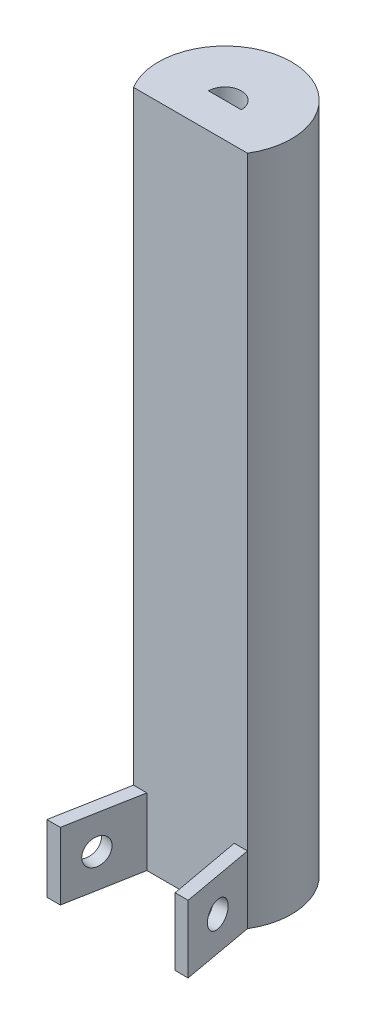
ISO-10303-21;
HEADER;
FILE_DESCRIPTION(('STEP AP214'),'2;1');
FILE_NAME('part.step','',(''),(''),'','','');
FILE_SCHEMA(('AUTOMOTIVE_DESIGN { 1 0 10303 214 1 1 1 1 }'));
ENDSEC;
DATA;
#1=APPLICATION_CONTEXT('core data for automotive mechanical design processes');
#2=APPLICATION_PROTOCOL_DEFINITION('international standard','automotive_design',2000,#1);
#3=PRODUCT_CONTEXT('',#1,'mechanical');
#4=PRODUCT('Part','Part','',(#3));
#5=PRODUCT_RELATED_PRODUCT_CATEGORY('part','',(#4));
#6=PRODUCT_DEFINITION_FORMATION('','',#4);
#7=PRODUCT_DEFINITION_CONTEXT('part definition',#1,'design');
#8=PRODUCT_DEFINITION('design','',#6,#7);
#9=PRODUCT_DEFINITION_SHAPE('','',#8);
#10=(LENGTH_UNIT() NAMED_UNIT(*) SI_UNIT(.MILLI.,.METRE.));
#11=(NAMED_UNIT(*) PLANE_ANGLE_UNIT() SI_UNIT($,.RADIAN.));
#12=(NAMED_UNIT(*) SI_UNIT($,.STERADIAN.) SOLID_ANGLE_UNIT());
#13=UNCERTAINTY_MEASURE_WITH_UNIT(LENGTH_MEASURE(1.E-05),#10,'distance_accuracy_value','');
#14=(GEOMETRIC_REPRESENTATION_CONTEXT(3) GLOBAL_UNCERTAINTY_ASSIGNED_CONTEXT((#13)) GLOBAL_UNIT_ASSIGNED_CONTEXT((#10,
#11,#12)) REPRESENTATION_CONTEXT('',''));
#15=CARTESIAN_POINT('',(0.,0.,0.));
#16=DIRECTION('',(0.,0.,1.));
#17=DIRECTION('',(1.,0.,0.));
#18=AXIS2_PLACEMENT_3D('',#15,#16,#17);
#19=CARTESIAN_POINT('',(0.,-127.254,0.));
#20=DIRECTION('',(0.,1.,0.));
#21=DIRECTION('',(0.,0.,1.));
#22=AXIS2_PLACEMENT_3D('',#19,#20,#21);
#23=CYLINDRICAL_SURFACE('',#22,12.6251531398367);
#24=DIRECTION('',(0.,-1.,0.));
#25=VECTOR('',#24,1.);
#26=CARTESIAN_POINT('',(10.8004451861737,28.448,6.53795652974117));
#27=LINE('',#26,#25);
#28=CARTESIAN_POINT('',(10.8004451861737,0.,6.53795652974117));
#29=VERTEX_POINT('',#28);
#30=CARTESIAN_POINT('',(10.8004451861737,-114.498809878987,6.53795652974117));
#31=VERTEX_POINT('',#30);
#32=EDGE_CURVE('E197',#29,#31,#27,.T.);
#33=ORIENTED_EDGE('',*,*,#32,.T.);
#34=DIRECTION('',(0.,-1.,0.));
#35=VECTOR('',#34,1.);
#36=CARTESIAN_POINT('',(10.8004451861737,-114.498809878987,6.53795652974117));
#37=LINE('',#36,#35);
#38=CARTESIAN_POINT('',(10.8004451861737,-127.254,6.53795652974117));
#39=VERTEX_POINT('',#38);
#40=EDGE_CURVE('E137',#31,#39,#37,.T.);
#41=ORIENTED_EDGE('',*,*,#40,.T.);
#42=CARTESIAN_POINT('',(0.,-127.254,0.));
#43=DIRECTION('',(0.,1.,0.));
#44=DIRECTION('',(0.,0.,1.));
#45=AXIS2_PLACEMENT_3D('',#42,#43,#44);
#46=CIRCLE('',#45,12.6251531398367);
#47=CARTESIAN_POINT('',(-10.8004451861737,-127.254,6.53795652974117));
#48=VERTEX_POINT('',#47);
#49=EDGE_CURVE('E202',#39,#48,#46,.T.);
#50=ORIENTED_EDGE('',*,*,#49,.T.);
#51=DIRECTION('',(0.,-1.,0.));
#52=VECTOR('',#51,1.);
#53=CARTESIAN_POINT('',(-10.8004451861737,-114.498809878987,6.53795652974117));
#54=LINE('',#53,#52);
#55=CARTESIAN_POINT('',(-10.8004451861737,-114.498809878987,6.53795652974117));
#56=VERTEX_POINT('',#55);
#57=EDGE_CURVE('E181',#56,#48,#54,.T.);
#58=ORIENTED_EDGE('',*,*,#57,.F.);
#59=DIRECTION('',(0.,-1.,0.));
#60=VECTOR('',#59,1.);
#61=CARTESIAN_POINT('',(-10.8004451861737,28.448,6.53795652974117));
#62=LINE('',#61,#60);
#63=CARTESIAN_POINT('',(-10.8004451861737,0.,6.53795652974117));
#64=VERTEX_POINT('',#63);
#65=EDGE_CURVE('E196',#64,#56,#62,.T.);
#66=ORIENTED_EDGE('',*,*,#65,.F.);
#67=CARTESIAN_POINT('',(0.,0.,0.));
#68=DIRECTION('',(0.,1.,0.));
#69=DIRECTION('',(0.,0.,1.));
#70=AXIS2_PLACEMENT_3D('',#67,#68,#69);
#71=CIRCLE('',#70,12.6251531398367);
#72=EDGE_CURVE('E199',#29,#64,#71,.T.);
#73=ORIENTED_EDGE('',*,*,#72,.F.);
#74=EDGE_LOOP('',(#33,#41,#50,#58,#66,#73));
#75=FACE_BOUND('',#74,.T.);
#76=ADVANCED_FACE('F33',(#75),#23,.T.);
#77=CARTESIAN_POINT('',(0.,-127.254,0.));
#78=DIRECTION('',(0.,1.,0.));
#79=DIRECTION('',(0.,0.,1.));
#80=AXIS2_PLACEMENT_3D('',#77,#78,#79);
#81=PLANE('',#80);
#82=DIRECTION('',(-1.,0.,0.));
#83=VECTOR('',#82,1.);
#84=CARTESIAN_POINT('',(-3.12616908784099,-127.254,0.));
#85=LINE('',#84,#83);
#86=CARTESIAN_POINT('',(3.09162578300214,-127.254,0.));
#87=VERTEX_POINT('',#86);
#88=CARTESIAN_POINT('',(-3.12616908784099,-127.254,0.));
#89=VERTEX_POINT('',#88);
#90=EDGE_CURVE('E186',#87,#89,#85,.T.);
#91=ORIENTED_EDGE('',*,*,#90,.F.);
#92=CARTESIAN_POINT('',(-0.0172716524194207,-127.254,0.));
#93=DIRECTION('',(0.,-1.,0.));
#94=DIRECTION('',(0.,0.,1.));
#95=AXIS2_PLACEMENT_3D('',#92,#93,#94);
#96=CIRCLE('',#95,3.10889743542157);
#97=EDGE_CURVE('E177',#89,#87,#96,.T.);
#98=ORIENTED_EDGE('',*,*,#97,.F.);
#99=EDGE_LOOP('',(#91,#98));
#100=FACE_BOUND('',#99,.T.);
#101=ORIENTED_EDGE('',*,*,#49,.F.);
#102=DIRECTION('',(0.176835796111787,0.,0.984240367600065));
#103=VECTOR('',#102,1.);
#104=CARTESIAN_POINT('',(13.2655796826163,-127.254,20.2585093607326));
#105=LINE('',#104,#103);
#106=CARTESIAN_POINT('',(13.2655796826163,-127.254,20.2585093607326));
#107=VERTEX_POINT('',#106);
#108=EDGE_CURVE('E148',#39,#107,#105,.T.);
#109=ORIENTED_EDGE('',*,*,#108,.T.);
#110=DIRECTION('',(-1.,0.,0.));
#111=VECTOR('',#110,1.);
#112=CARTESIAN_POINT('',(10.8004451861737,-127.254,20.2585093607326));
#113=LINE('',#112,#111);
#114=CARTESIAN_POINT('',(10.8004451861737,-127.254,20.2585093607326));
#115=VERTEX_POINT('',#114);
#116=EDGE_CURVE('E120',#107,#115,#113,.T.);
#117=ORIENTED_EDGE('',*,*,#116,.T.);
#118=DIRECTION('',(-0.180128494134073,0.,-0.983643088523978));
#119=VECTOR('',#118,1.);
#120=CARTESIAN_POINT('',(8.28788494052397,-127.254,6.53795652974117));
#121=LINE('',#120,#119);
#122=CARTESIAN_POINT('',(8.28788494052397,-127.254,6.53795652974117));
#123=VERTEX_POINT('',#122);
#124=EDGE_CURVE('E138',#115,#123,#121,.T.);
#125=ORIENTED_EDGE('',*,*,#124,.T.);
#126=DIRECTION('',(1.,0.,0.));
#127=VECTOR('',#126,1.);
#128=CARTESIAN_POINT('',(10.8004451861737,-127.254,6.53795652974117));
#129=LINE('',#128,#127);
#130=CARTESIAN_POINT('',(-8.27477707509697,-127.254,6.53795652974117));
#131=VERTEX_POINT('',#130);
#132=EDGE_CURVE('E192',#131,#123,#129,.T.);
#133=ORIENTED_EDGE('',*,*,#132,.F.);
#134=DIRECTION('',(-0.179298731578309,0.,0.983794676166938));
#135=VECTOR('',#134,1.);
#136=CARTESIAN_POINT('',(-8.27477707509697,-127.254,6.53795652974117));
#137=LINE('',#136,#135);
#138=CARTESIAN_POINT('',(-10.8004451861737,-127.254,20.3960514508237));
#139=VERTEX_POINT('',#138);
#140=EDGE_CURVE('E159',#131,#139,#137,.T.);
#141=ORIENTED_EDGE('',*,*,#140,.T.);
#142=DIRECTION('',(-1.,0.,0.));
#143=VECTOR('',#142,1.);
#144=CARTESIAN_POINT('',(-10.8004451861737,-127.254,20.3960514508237));
#145=LINE('',#144,#143);
#146=CARTESIAN_POINT('',(-13.364649968782,-127.254,20.3960514508237));
#147=VERTEX_POINT('',#146);
#148=EDGE_CURVE('E152',#139,#147,#145,.T.);
#149=ORIENTED_EDGE('',*,*,#148,.T.);
#150=DIRECTION('',(0.181944568373949,0.,-0.983308788753165));
#151=VECTOR('',#150,1.);
#152=CARTESIAN_POINT('',(-13.364649968782,-127.254,20.3960514508237));
#153=LINE('',#152,#151);
#154=EDGE_CURVE('E170',#147,#48,#153,.T.);
#155=ORIENTED_EDGE('',*,*,#154,.T.);
#156=EDGE_LOOP('',(#101,#109,#117,#125,#133,#141,#149,#155));
#157=FACE_BOUND('',#156,.T.);
#158=ADVANCED_FACE('F222',(#100,#157),#81,.F.);
#159=CARTESIAN_POINT('',(0.,0.,0.));
#160=DIRECTION('',(0.,1.,0.));
#161=DIRECTION('',(0.,0.,1.));
#162=AXIS2_PLACEMENT_3D('',#159,#160,#161);
#163=PLANE('',#162);
#164=CARTESIAN_POINT('',(-0.0172716524194207,0.,0.));
#165=DIRECTION('',(0.,1.,0.));
#166=DIRECTION('',(0.,0.,1.));
#167=AXIS2_PLACEMENT_3D('',#164,#165,#166);
#168=CIRCLE('',#167,3.10889743542157);
#169=CARTESIAN_POINT('',(3.09162578300214,0.,0.));
#170=VERTEX_POINT('',#169);
#171=CARTESIAN_POINT('',(-3.12616908784099,0.,0.));
#172=VERTEX_POINT('',#171);
#173=EDGE_CURVE('E11',#170,#172,#168,.T.);
#174=ORIENTED_EDGE('',*,*,#173,.F.);
#175=DIRECTION('',(1.,0.,0.));
#176=VECTOR('',#175,1.);
#177=CARTESIAN_POINT('',(0.,0.,0.));
#178=LINE('',#177,#176);
#179=EDGE_CURVE('E41',#172,#170,#178,.T.);
#180=ORIENTED_EDGE('',*,*,#179,.F.);
#181=EDGE_LOOP('',(#174,#180));
#182=FACE_BOUND('',#181,.T.);
#183=DIRECTION('',(-1.,0.,0.));
#184=VECTOR('',#183,1.);
#185=CARTESIAN_POINT('',(0.,0.,6.53795652974117));
#186=LINE('',#185,#184);
#187=EDGE_CURVE('E204',#29,#64,#186,.T.);
#188=ORIENTED_EDGE('',*,*,#187,.F.);
#189=ORIENTED_EDGE('',*,*,#72,.T.);
#190=EDGE_LOOP('',(#188,#189));
#191=FACE_BOUND('',#190,.T.);
#192=ADVANCED_FACE('F218',(#182,#191),#163,.T.);
#193=CARTESIAN_POINT('',(10.8004451861737,28.448,6.53795652974117));
#194=DIRECTION('',(0.,0.,-1.));
#195=DIRECTION('',(-1.,0.,0.));
#196=AXIS2_PLACEMENT_3D('',#193,#194,#195);
#197=PLANE('',#196);
#198=ORIENTED_EDGE('',*,*,#132,.T.);
#199=DIRECTION('',(0.,-1.,0.));
#200=VECTOR('',#199,1.);
#201=CARTESIAN_POINT('',(8.28788494052397,-114.498809878987,6.53795652974117));
#202=LINE('',#201,#200);
#203=CARTESIAN_POINT('',(8.28788494052397,-114.498809878987,6.53795652974117));
#204=VERTEX_POINT('',#203);
#205=EDGE_CURVE('E48',#204,#123,#202,.T.);
#206=ORIENTED_EDGE('',*,*,#205,.F.);
#207=DIRECTION('',(1.,0.,0.));
#208=VECTOR('',#207,1.);
#209=CARTESIAN_POINT('',(10.8004451861737,-114.498809878987,6.53795652974117));
#210=LINE('',#209,#208);
#211=EDGE_CURVE('E53',#204,#31,#210,.T.);
#212=ORIENTED_EDGE('',*,*,#211,.T.);
#213=ORIENTED_EDGE('',*,*,#32,.F.);
#214=ORIENTED_EDGE('',*,*,#187,.T.);
#215=ORIENTED_EDGE('',*,*,#65,.T.);
#216=DIRECTION('',(1.,0.,0.));
#217=VECTOR('',#216,1.);
#218=CARTESIAN_POINT('',(-10.8004451861737,-114.498809878987,6.53795652974117));
#219=LINE('',#218,#217);
#220=CARTESIAN_POINT('',(-8.27477707509697,-114.498809878987,6.53795652974117));
#221=VERTEX_POINT('',#220);
#222=EDGE_CURVE('E162',#56,#221,#219,.T.);
#223=ORIENTED_EDGE('',*,*,#222,.T.);
#224=DIRECTION('',(0.,-1.,0.));
#225=VECTOR('',#224,1.);
#226=CARTESIAN_POINT('',(-8.27477707509697,-114.498809878987,6.53795652974117));
#227=LINE('',#226,#225);
#228=EDGE_CURVE('E178',#221,#131,#227,.T.);
#229=ORIENTED_EDGE('',*,*,#228,.T.);
#230=EDGE_LOOP('',(#198,#206,#212,#213,#214,#215,#223,#229));
#231=FACE_BOUND('',#230,.T.);
#232=ADVANCED_FACE('F221',(#231),#197,.F.);
#233=CARTESIAN_POINT('',(-0.0172716524194207,13.827655766843,0.));
#234=DIRECTION('',(0.,-1.,0.));
#235=DIRECTION('',(0.,0.,-1.));
#236=AXIS2_PLACEMENT_3D('',#233,#234,#235);
#237=CYLINDRICAL_SURFACE('',#236,3.10889743542157);
#238=ORIENTED_EDGE('',*,*,#173,.T.);
#239=DIRECTION('',(0.,-1.,0.));
#240=VECTOR('',#239,1.);
#241=CARTESIAN_POINT('',(-3.12616908784099,13.827655766843,0.));
#242=LINE('',#241,#240);
#243=EDGE_CURVE('E190',#172,#89,#242,.T.);
#244=ORIENTED_EDGE('',*,*,#243,.T.);
#245=ORIENTED_EDGE('',*,*,#97,.T.);
#246=DIRECTION('',(0.,-1.,0.));
#247=VECTOR('',#246,1.);
#248=CARTESIAN_POINT('',(3.09162578300214,13.827655766843,0.));
#249=LINE('',#248,#247);
#250=EDGE_CURVE('E189',#170,#87,#249,.T.);
#251=ORIENTED_EDGE('',*,*,#250,.F.);
#252=EDGE_LOOP('',(#238,#244,#245,#251));
#253=FACE_BOUND('',#252,.T.);
#254=ADVANCED_FACE('F216',(#253),#237,.F.);
#255=CARTESIAN_POINT('',(-3.12616908784099,13.827655766843,0.));
#256=DIRECTION('',(0.,0.,1.));
#257=DIRECTION('',(1.,0.,0.));
#258=AXIS2_PLACEMENT_3D('',#255,#256,#257);
#259=PLANE('',#258);
#260=ORIENTED_EDGE('',*,*,#179,.T.);
#261=ORIENTED_EDGE('',*,*,#250,.T.);
#262=ORIENTED_EDGE('',*,*,#90,.T.);
#263=ORIENTED_EDGE('',*,*,#243,.F.);
#264=EDGE_LOOP('',(#260,#261,#262,#263));
#265=FACE_BOUND('',#264,.T.);
#266=ADVANCED_FACE('F211',(#265),#259,.F.);
#267=CARTESIAN_POINT('',(-10.8004451861737,-114.498809878987,20.3960514508237));
#268=DIRECTION('',(0.,0.,1.));
#269=DIRECTION('',(1.,0.,0.));
#270=AXIS2_PLACEMENT_3D('',#267,#268,#269);
#271=PLANE('',#270);
#272=ORIENTED_EDGE('',*,*,#148,.F.);
#273=DIRECTION('',(0.,-1.,0.));
#274=VECTOR('',#273,1.);
#275=CARTESIAN_POINT('',(-10.8004451861737,-114.498809878987,20.3960514508237));
#276=LINE('',#275,#274);
#277=CARTESIAN_POINT('',(-10.8004451861737,-114.498809878987,20.3960514508237));
#278=VERTEX_POINT('',#277);
#279=EDGE_CURVE('E175',#278,#139,#276,.T.);
#280=ORIENTED_EDGE('',*,*,#279,.F.);
#281=DIRECTION('',(-1.,0.,0.));
#282=VECTOR('',#281,1.);
#283=CARTESIAN_POINT('',(-10.8004451861737,-114.498809878987,20.3960514508237));
#284=LINE('',#283,#282);
#285=CARTESIAN_POINT('',(-13.364649968782,-114.498809878987,20.3960514508237));
#286=VERTEX_POINT('',#285);
#287=EDGE_CURVE('E155',#278,#286,#284,.T.);
#288=ORIENTED_EDGE('',*,*,#287,.T.);
#289=DIRECTION('',(0.,-1.,0.));
#290=VECTOR('',#289,1.);
#291=CARTESIAN_POINT('',(-13.364649968782,-114.498809878987,20.3960514508237));
#292=LINE('',#291,#290);
#293=EDGE_CURVE('E167',#286,#147,#292,.T.);
#294=ORIENTED_EDGE('',*,*,#293,.T.);
#295=EDGE_LOOP('',(#272,#280,#288,#294));
#296=FACE_BOUND('',#295,.T.);
#297=ADVANCED_FACE('F239',(#296),#271,.T.);
#298=CARTESIAN_POINT('',(-8.27477707509697,-114.498809878987,6.53795652974117));
#299=DIRECTION('',(0.983794676166938,0.,0.179298731578309));
#300=DIRECTION('',(0.179298731578309,0.,-0.983794676166938));
#301=AXIS2_PLACEMENT_3D('',#298,#299,#300);
#302=PLANE('',#301);
#303=CARTESIAN_POINT('',(-9.73336349719187,-120.876404939494,14.5410781589627));
#304=DIRECTION('',(0.983794676166938,0.,0.179298731578309));
#305=DIRECTION('',(0.179298731578309,0.,-0.983794676166938));
#306=AXIS2_PLACEMENT_3D('',#303,#304,#305);
#307=ELLIPSE('',#306,2.4723147563843,2.47230581088331);
#308=CARTESIAN_POINT('',(-9.29008059730983,-120.876404939494,12.1088280638228));
#309=VERTEX_POINT('',#308);
#310=EDGE_CURVE('E292',#309,#309,#307,.T.);
#311=ORIENTED_EDGE('',*,*,#310,.F.);
#312=EDGE_LOOP('',(#311));
#313=FACE_BOUND('',#312,.T.);
#314=ORIENTED_EDGE('',*,*,#140,.F.);
#315=ORIENTED_EDGE('',*,*,#228,.F.);
#316=DIRECTION('',(-0.179298731578309,0.,0.983794676166938));
#317=VECTOR('',#316,1.);
#318=CARTESIAN_POINT('',(-8.27477707509697,-114.498809878987,6.53795652974117));
#319=LINE('',#318,#317);
#320=EDGE_CURVE('E164',#221,#278,#319,.T.);
#321=ORIENTED_EDGE('',*,*,#320,.T.);
#322=ORIENTED_EDGE('',*,*,#279,.T.);
#323=EDGE_LOOP('',(#314,#315,#321,#322));
#324=FACE_BOUND('',#323,.T.);
#325=ADVANCED_FACE('F242',(#313,#324),#302,.T.);
#326=CARTESIAN_POINT('',(-13.364649968782,-114.498809878987,20.3960514508237));
#327=DIRECTION('',(-0.983308788753165,0.,-0.181944568373949));
#328=DIRECTION('',(-0.181944568373949,0.,0.983308788753166));
#329=AXIS2_PLACEMENT_3D('',#326,#327,#328);
#330=PLANE('',#329);
#331=CARTESIAN_POINT('',(-12.1969407283227,-120.876404939494,14.0852350900297));
#332=DIRECTION('',(-0.983308788753166,0.,-0.181944568373949));
#333=DIRECTION('',(-0.181944568373949,0.,0.983308788753166));
#334=AXIS2_PLACEMENT_3D('',#331,#332,#333);
#335=CIRCLE('',#334,2.47230581088331);
#336=CARTESIAN_POINT('',(-12.6467633419722,-120.876404939494,16.5162751223568));
#337=VERTEX_POINT('',#336);
#338=EDGE_CURVE('E295',#337,#337,#335,.T.);
#339=ORIENTED_EDGE('',*,*,#338,.F.);
#340=EDGE_LOOP('',(#339));
#341=FACE_BOUND('',#340,.T.);
#342=ORIENTED_EDGE('',*,*,#154,.F.);
#343=ORIENTED_EDGE('',*,*,#293,.F.);
#344=DIRECTION('',(0.181944568373949,0.,-0.983308788753165));
#345=VECTOR('',#344,1.);
#346=CARTESIAN_POINT('',(-13.364649968782,-114.498809878987,20.3960514508237));
#347=LINE('',#346,#345);
#348=EDGE_CURVE('E158',#286,#56,#347,.T.);
#349=ORIENTED_EDGE('',*,*,#348,.T.);
#350=ORIENTED_EDGE('',*,*,#57,.T.);
#351=EDGE_LOOP('',(#342,#343,#349,#350));
#352=FACE_BOUND('',#351,.T.);
#353=ADVANCED_FACE('F236',(#341,#352),#330,.T.);
#354=CARTESIAN_POINT('',(0.,-114.498809878987,0.));
#355=DIRECTION('',(0.,1.,0.));
#356=DIRECTION('',(0.,0.,1.));
#357=AXIS2_PLACEMENT_3D('',#354,#355,#356);
#358=PLANE('',#357);
#359=ORIENTED_EDGE('',*,*,#287,.F.);
#360=ORIENTED_EDGE('',*,*,#320,.F.);
#361=ORIENTED_EDGE('',*,*,#222,.F.);
#362=ORIENTED_EDGE('',*,*,#348,.F.);
#363=EDGE_LOOP('',(#359,#360,#361,#362));
#364=FACE_BOUND('',#363,.T.);
#365=ADVANCED_FACE('F233',(#364),#358,.T.);
#366=CARTESIAN_POINT('',(13.2655796826163,-114.498809878987,20.2585093607326));
#367=DIRECTION('',(0.984240367600065,0.,-0.176835796111787));
#368=DIRECTION('',(-0.176835796111787,0.,-0.984240367600065));
#369=AXIS2_PLACEMENT_3D('',#366,#367,#368);
#370=PLANE('',#369);
#371=CARTESIAN_POINT('',(12.033012434395,-120.832304410363,13.3982329452369));
#372=DIRECTION('',(0.984240367600065,0.,-0.176835796111787));
#373=DIRECTION('',(-0.176835796111787,0.,-0.984240367600065));
#374=AXIS2_PLACEMENT_3D('',#371,#372,#373);
#375=CIRCLE('',#374,2.435016117644);
#376=CARTESIAN_POINT('',(11.6024144206864,-120.832304410363,11.0015917864949));
#377=VERTEX_POINT('',#376);
#378=EDGE_CURVE('E143',#377,#377,#375,.T.);
#379=ORIENTED_EDGE('',*,*,#378,.F.);
#380=EDGE_LOOP('',(#379));
#381=FACE_BOUND('',#380,.T.);
#382=ORIENTED_EDGE('',*,*,#108,.F.);
#383=ORIENTED_EDGE('',*,*,#40,.F.);
#384=DIRECTION('',(0.176835796111787,0.,0.984240367600065));
#385=VECTOR('',#384,1.);
#386=CARTESIAN_POINT('',(13.2655796826163,-114.498809878987,20.2585093607326));
#387=LINE('',#386,#385);
#388=CARTESIAN_POINT('',(13.2655796826163,-114.498809878987,20.2585093607326));
#389=VERTEX_POINT('',#388);
#390=EDGE_CURVE('E131',#31,#389,#387,.T.);
#391=ORIENTED_EDGE('',*,*,#390,.T.);
#392=DIRECTION('',(0.,-1.,0.));
#393=VECTOR('',#392,1.);
#394=CARTESIAN_POINT('',(13.2655796826163,-114.498809878987,20.2585093607326));
#395=LINE('',#394,#393);
#396=EDGE_CURVE('E115',#389,#107,#395,.T.);
#397=ORIENTED_EDGE('',*,*,#396,.T.);
#398=EDGE_LOOP('',(#382,#383,#391,#397));
#399=FACE_BOUND('',#398,.T.);
#400=ADVANCED_FACE('F135',(#381,#399),#370,.T.);
#401=CARTESIAN_POINT('',(8.28788494052397,-114.498809878987,6.53795652974117));
#402=DIRECTION('',(-0.983643088523978,0.,0.180128494134074));
#403=DIRECTION('',(0.180128494134074,0.,0.983643088523978));
#404=AXIS2_PLACEMENT_3D('',#401,#402,#403);
#405=PLANE('',#404);
#406=CARTESIAN_POINT('',(9.62344317486977,-120.832304410363,13.8311537157328));
#407=DIRECTION('',(-0.983643088523978,0.,0.180128494134074));
#408=DIRECTION('',(0.180128494134074,0.,0.983643088523978));
#409=AXIS2_PLACEMENT_3D('',#406,#407,#408);
#410=ELLIPSE('',#409,2.43502975210921,2.435016117644);
#411=CARTESIAN_POINT('',(10.0620614172889,-120.832304410363,16.2263539017453));
#412=VERTEX_POINT('',#411);
#413=EDGE_CURVE('E36',#412,#412,#410,.T.);
#414=ORIENTED_EDGE('',*,*,#413,.F.);
#415=EDGE_LOOP('',(#414));
#416=FACE_BOUND('',#415,.T.);
#417=ORIENTED_EDGE('',*,*,#124,.F.);
#418=DIRECTION('',(0.,-1.,0.));
#419=VECTOR('',#418,1.);
#420=CARTESIAN_POINT('',(10.8004451861737,-114.498809878987,20.2585093607326));
#421=LINE('',#420,#419);
#422=CARTESIAN_POINT('',(10.8004451861737,-114.498809878987,20.2585093607326));
#423=VERTEX_POINT('',#422);
#424=EDGE_CURVE('E125',#423,#115,#421,.T.);
#425=ORIENTED_EDGE('',*,*,#424,.F.);
#426=DIRECTION('',(-0.180128494134073,0.,-0.983643088523978));
#427=VECTOR('',#426,1.);
#428=CARTESIAN_POINT('',(8.28788494052397,-114.498809878987,6.53795652974117));
#429=LINE('',#428,#427);
#430=EDGE_CURVE('E132',#423,#204,#429,.T.);
#431=ORIENTED_EDGE('',*,*,#430,.T.);
#432=ORIENTED_EDGE('',*,*,#205,.T.);
#433=EDGE_LOOP('',(#417,#425,#431,#432));
#434=FACE_BOUND('',#433,.T.);
#435=ADVANCED_FACE('F246',(#416,#434),#405,.T.);
#436=CARTESIAN_POINT('',(10.8004451861737,-114.498809878987,20.2585093607326));
#437=DIRECTION('',(0.,0.,1.));
#438=DIRECTION('',(1.,0.,0.));
#439=AXIS2_PLACEMENT_3D('',#436,#437,#438);
#440=PLANE('',#439);
#441=ORIENTED_EDGE('',*,*,#116,.F.);
#442=ORIENTED_EDGE('',*,*,#396,.F.);
#443=DIRECTION('',(-1.,0.,0.));
#444=VECTOR('',#443,1.);
#445=CARTESIAN_POINT('',(10.8004451861737,-114.498809878987,20.2585093607326));
#446=LINE('',#445,#444);
#447=EDGE_CURVE('E118',#389,#423,#446,.T.);
#448=ORIENTED_EDGE('',*,*,#447,.T.);
#449=ORIENTED_EDGE('',*,*,#424,.T.);
#450=EDGE_LOOP('',(#441,#442,#448,#449));
#451=FACE_BOUND('',#450,.T.);
#452=ADVANCED_FACE('F117',(#451),#440,.T.);
#453=CARTESIAN_POINT('',(0.,-114.498809878987,0.));
#454=DIRECTION('',(0.,1.,0.));
#455=DIRECTION('',(0.,0.,1.));
#456=AXIS2_PLACEMENT_3D('',#453,#454,#455);
#457=PLANE('',#456);
#458=ORIENTED_EDGE('',*,*,#390,.F.);
#459=ORIENTED_EDGE('',*,*,#211,.F.);
#460=ORIENTED_EDGE('',*,*,#430,.F.);
#461=ORIENTED_EDGE('',*,*,#447,.F.);
#462=EDGE_LOOP('',(#458,#459,#460,#461));
#463=FACE_BOUND('',#462,.T.);
#464=ADVANCED_FACE('F130',(#463),#457,.T.);
#465=CARTESIAN_POINT('',(0.97882174110293,-120.832304410363,15.3843093915691));
#466=DIRECTION('',(0.984240367600065,0.,-0.176835796111787));
#467=DIRECTION('',(-0.176835796111787,0.,-0.984240367600065));
#468=AXIS2_PLACEMENT_3D('',#465,#466,#467);
#469=CYLINDRICAL_SURFACE('',#468,2.435016117644);
#470=ORIENTED_EDGE('',*,*,#413,.T.);
#471=EDGE_LOOP('',(#470));
#472=FACE_BOUND('',#471,.T.);
#473=ORIENTED_EDGE('',*,*,#378,.T.);
#474=EDGE_LOOP('',(#473));
#475=FACE_BOUND('',#474,.T.);
#476=ADVANCED_FACE('F280',(#472,#475),#469,.F.);
#477=CARTESIAN_POINT('',(-1.40297320651615,-120.876404939494,16.0824752085562));
#478=DIRECTION('',(-0.983308788753165,0.,-0.181944568373949));
#479=DIRECTION('',(-0.181944568373949,0.,0.983308788753166));
#480=AXIS2_PLACEMENT_3D('',#477,#478,#479);
#481=CYLINDRICAL_SURFACE('',#480,2.47230581088331);
#482=ORIENTED_EDGE('',*,*,#310,.T.);
#483=EDGE_LOOP('',(#482));
#484=FACE_BOUND('',#483,.T.);
#485=ORIENTED_EDGE('',*,*,#338,.T.);
#486=EDGE_LOOP('',(#485));
#487=FACE_BOUND('',#486,.T.);
#488=ADVANCED_FACE('F283',(#484,#487),#481,.F.);
#489=CLOSED_SHELL('',(#76,#158,#192,#232,#254,#266,#297,#325,#353,#365,#400,#435,#452,#464,#476,#488));
#490=MANIFOLD_SOLID_BREP('B2',#489);
#491=ADVANCED_BREP_SHAPE_REPRESENTATION('',(#18,#490),#14);
#492=SHAPE_DEFINITION_REPRESENTATION(#9,#491);
ENDSEC;
END-ISO-10303-21;
